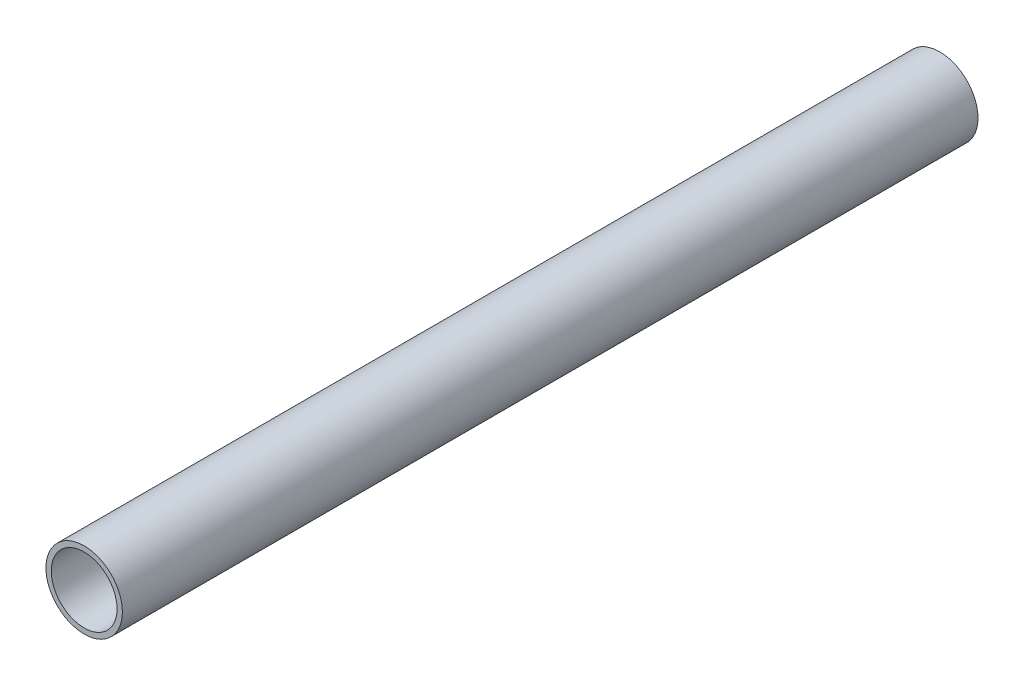
ISO-10303-21;
HEADER;
FILE_DESCRIPTION(('STEP AP214'),'2;1');
FILE_NAME('part.step','',(''),(''),'','','');
FILE_SCHEMA(('AUTOMOTIVE_DESIGN { 1 0 10303 214 1 1 1 1 }'));
ENDSEC;
DATA;
#1=APPLICATION_CONTEXT('core data for automotive mechanical design processes');
#2=APPLICATION_PROTOCOL_DEFINITION('international standard','automotive_design',2000,#1);
#3=PRODUCT_CONTEXT('',#1,'mechanical');
#4=PRODUCT('Part','Part','',(#3));
#5=PRODUCT_RELATED_PRODUCT_CATEGORY('part','',(#4));
#6=PRODUCT_DEFINITION_FORMATION('','',#4);
#7=PRODUCT_DEFINITION_CONTEXT('part definition',#1,'design');
#8=PRODUCT_DEFINITION('design','',#6,#7);
#9=PRODUCT_DEFINITION_SHAPE('','',#8);
#10=(LENGTH_UNIT() NAMED_UNIT(*) SI_UNIT(.MILLI.,.METRE.));
#11=(NAMED_UNIT(*) PLANE_ANGLE_UNIT() SI_UNIT($,.RADIAN.));
#12=(NAMED_UNIT(*) SI_UNIT($,.STERADIAN.) SOLID_ANGLE_UNIT());
#13=UNCERTAINTY_MEASURE_WITH_UNIT(LENGTH_MEASURE(1.E-05),#10,'distance_accuracy_value','');
#14=(GEOMETRIC_REPRESENTATION_CONTEXT(3) GLOBAL_UNCERTAINTY_ASSIGNED_CONTEXT((#13)) GLOBAL_UNIT_ASSIGNED_CONTEXT((#10,
#11,#12)) REPRESENTATION_CONTEXT('',''));
#15=CARTESIAN_POINT('',(0.,0.,0.));
#16=DIRECTION('',(0.,0.,1.));
#17=DIRECTION('',(1.,0.,0.));
#18=AXIS2_PLACEMENT_3D('',#15,#16,#17);
#19=CARTESIAN_POINT('',(0.,0.,169.));
#20=DIRECTION('',(0.,0.,1.));
#21=DIRECTION('',(1.,0.,0.));
#22=AXIS2_PLACEMENT_3D('',#19,#20,#21);
#23=PLANE('',#22);
#24=CARTESIAN_POINT('',(0.,0.,169.));
#25=DIRECTION('',(0.,0.,1.));
#26=DIRECTION('',(1.,0.,0.));
#27=AXIS2_PLACEMENT_3D('',#24,#25,#26);
#28=CIRCLE('',#27,7.55);
#29=CARTESIAN_POINT('',(7.55,0.,169.));
#30=VERTEX_POINT('',#29);
#31=EDGE_CURVE('E10',#30,#30,#28,.T.);
#32=ORIENTED_EDGE('',*,*,#31,.T.);
#33=EDGE_LOOP('',(#32));
#34=FACE_BOUND('',#33,.T.);
#35=CARTESIAN_POINT('',(0.,0.,169.));
#36=DIRECTION('',(0.,0.,1.));
#37=DIRECTION('',(1.,0.,0.));
#38=AXIS2_PLACEMENT_3D('',#35,#36,#37);
#39=CIRCLE('',#38,6.5);
#40=CARTESIAN_POINT('',(6.5,0.,169.));
#41=VERTEX_POINT('',#40);
#42=EDGE_CURVE('E43',#41,#41,#39,.T.);
#43=ORIENTED_EDGE('',*,*,#42,.F.);
#44=EDGE_LOOP('',(#43));
#45=FACE_BOUND('',#44,.T.);
#46=ADVANCED_FACE('F32',(#34,#45),#23,.T.);
#47=CARTESIAN_POINT('',(0.,0.,0.));
#48=DIRECTION('',(0.,0.,1.));
#49=DIRECTION('',(1.,0.,0.));
#50=AXIS2_PLACEMENT_3D('',#47,#48,#49);
#51=PLANE('',#50);
#52=CARTESIAN_POINT('',(0.,0.,0.));
#53=DIRECTION('',(0.,0.,1.));
#54=DIRECTION('',(1.,0.,0.));
#55=AXIS2_PLACEMENT_3D('',#52,#53,#54);
#56=CIRCLE('',#55,7.55);
#57=CARTESIAN_POINT('',(7.55,0.,0.));
#58=VERTEX_POINT('',#57);
#59=EDGE_CURVE('E36',#58,#58,#56,.T.);
#60=ORIENTED_EDGE('',*,*,#59,.F.);
#61=EDGE_LOOP('',(#60));
#62=FACE_BOUND('',#61,.T.);
#63=CARTESIAN_POINT('',(0.,0.,0.));
#64=DIRECTION('',(0.,0.,1.));
#65=DIRECTION('',(1.,0.,0.));
#66=AXIS2_PLACEMENT_3D('',#63,#64,#65);
#67=CIRCLE('',#66,6.5);
#68=CARTESIAN_POINT('',(6.5,0.,0.));
#69=VERTEX_POINT('',#68);
#70=EDGE_CURVE('E45',#69,#69,#67,.T.);
#71=ORIENTED_EDGE('',*,*,#70,.T.);
#72=EDGE_LOOP('',(#71));
#73=FACE_BOUND('',#72,.T.);
#74=ADVANCED_FACE('F55',(#62,#73),#51,.F.);
#75=CARTESIAN_POINT('',(0.,0.,169.));
#76=DIRECTION('',(0.,0.,-1.));
#77=DIRECTION('',(-1.,0.,0.));
#78=AXIS2_PLACEMENT_3D('',#75,#76,#77);
#79=CYLINDRICAL_SURFACE('',#78,7.55);
#80=ORIENTED_EDGE('',*,*,#31,.F.);
#81=EDGE_LOOP('',(#80));
#82=FACE_BOUND('',#81,.T.);
#83=ORIENTED_EDGE('',*,*,#59,.T.);
#84=EDGE_LOOP('',(#83));
#85=FACE_BOUND('',#84,.T.);
#86=ADVANCED_FACE('F34',(#82,#85),#79,.T.);
#87=CARTESIAN_POINT('',(0.,0.,169.));
#88=DIRECTION('',(0.,0.,-1.));
#89=DIRECTION('',(-1.,0.,0.));
#90=AXIS2_PLACEMENT_3D('',#87,#88,#89);
#91=CYLINDRICAL_SURFACE('',#90,6.5);
#92=ORIENTED_EDGE('',*,*,#42,.T.);
#93=EDGE_LOOP('',(#92));
#94=FACE_BOUND('',#93,.T.);
#95=ORIENTED_EDGE('',*,*,#70,.F.);
#96=EDGE_LOOP('',(#95));
#97=FACE_BOUND('',#96,.T.);
#98=ADVANCED_FACE('F51',(#94,#97),#91,.F.);
#99=CLOSED_SHELL('',(#46,#74,#86,#98));
#100=MANIFOLD_SOLID_BREP('B2',#99);
#101=ADVANCED_BREP_SHAPE_REPRESENTATION('',(#18,#100),#14);
#102=SHAPE_DEFINITION_REPRESENTATION(#9,#101);
ENDSEC;
END-ISO-10303-21;
